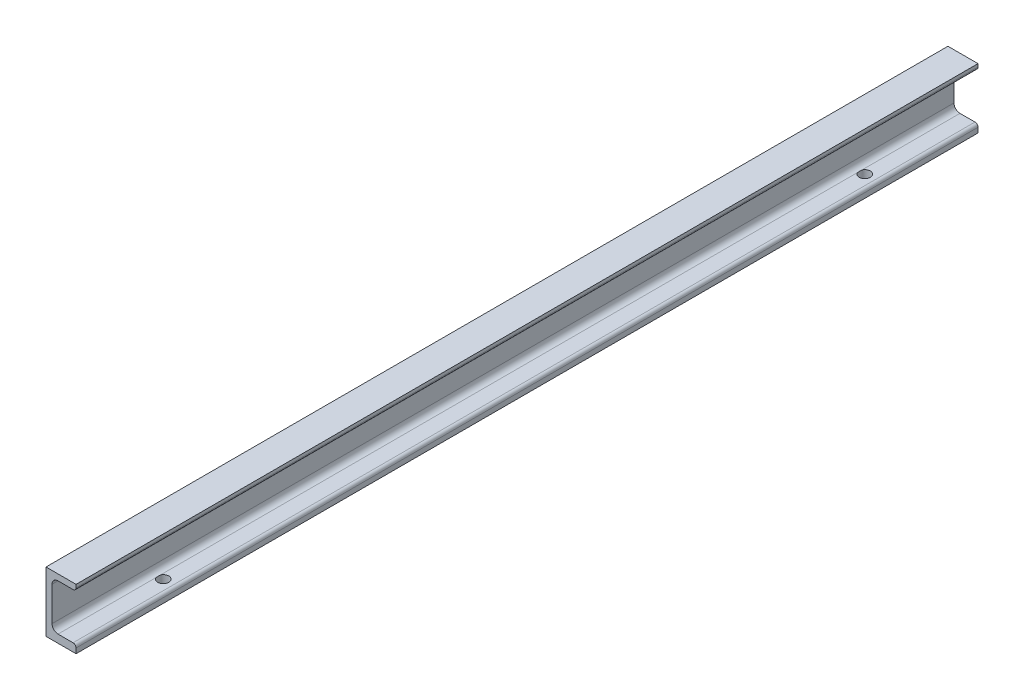
ISO-10303-21;
HEADER;
FILE_DESCRIPTION(('STEP AP214'),'2;1');
FILE_NAME('part.step','',(''),(''),'','','');
FILE_SCHEMA(('AUTOMOTIVE_DESIGN { 1 0 10303 214 1 1 1 1 }'));
ENDSEC;
DATA;
#1=APPLICATION_CONTEXT('core data for automotive mechanical design processes');
#2=APPLICATION_PROTOCOL_DEFINITION('international standard','automotive_design',2000,#1);
#3=PRODUCT_CONTEXT('',#1,'mechanical');
#4=PRODUCT('Part','Part','',(#3));
#5=PRODUCT_RELATED_PRODUCT_CATEGORY('part','',(#4));
#6=PRODUCT_DEFINITION_FORMATION('','',#4);
#7=PRODUCT_DEFINITION_CONTEXT('part definition',#1,'design');
#8=PRODUCT_DEFINITION('design','',#6,#7);
#9=PRODUCT_DEFINITION_SHAPE('','',#8);
#10=(LENGTH_UNIT() NAMED_UNIT(*) SI_UNIT(.MILLI.,.METRE.));
#11=(NAMED_UNIT(*) PLANE_ANGLE_UNIT() SI_UNIT($,.RADIAN.));
#12=(NAMED_UNIT(*) SI_UNIT($,.STERADIAN.) SOLID_ANGLE_UNIT());
#13=UNCERTAINTY_MEASURE_WITH_UNIT(LENGTH_MEASURE(1.E-05),#10,'distance_accuracy_value','');
#14=(GEOMETRIC_REPRESENTATION_CONTEXT(3) GLOBAL_UNCERTAINTY_ASSIGNED_CONTEXT((#13)) GLOBAL_UNIT_ASSIGNED_CONTEXT((#10,
#11,#12)) REPRESENTATION_CONTEXT('',''));
#15=CARTESIAN_POINT('',(0.,0.,0.));
#16=DIRECTION('',(0.,0.,1.));
#17=DIRECTION('',(1.,0.,0.));
#18=AXIS2_PLACEMENT_3D('',#15,#16,#17);
#19=CARTESIAN_POINT('',(15.,27.,450.));
#20=DIRECTION('',(-1.,0.,0.));
#21=DIRECTION('',(0.,0.,1.));
#22=AXIS2_PLACEMENT_3D('',#19,#20,#21);
#23=PLANE('',#22);
#24=DIRECTION('',(0.,1.,0.));
#25=VECTOR('',#24,1.);
#26=CARTESIAN_POINT('',(15.,27.,-450.));
#27=LINE('',#26,#25);
#28=CARTESIAN_POINT('',(15.,27.,-450.));
#29=VERTEX_POINT('',#28);
#30=CARTESIAN_POINT('',(15.,30.,-450.));
#31=VERTEX_POINT('',#30);
#32=EDGE_CURVE('E211',#29,#31,#27,.T.);
#33=ORIENTED_EDGE('',*,*,#32,.T.);
#34=DIRECTION('',(0.,0.,-1.));
#35=VECTOR('',#34,1.);
#36=CARTESIAN_POINT('',(15.,30.,450.));
#37=LINE('',#36,#35);
#38=CARTESIAN_POINT('',(15.,30.,450.));
#39=VERTEX_POINT('',#38);
#40=EDGE_CURVE('E11',#39,#31,#37,.T.);
#41=ORIENTED_EDGE('',*,*,#40,.F.);
#42=DIRECTION('',(0.,1.,0.));
#43=VECTOR('',#42,1.);
#44=CARTESIAN_POINT('',(15.,27.,450.));
#45=LINE('',#44,#43);
#46=CARTESIAN_POINT('',(15.,27.,450.));
#47=VERTEX_POINT('',#46);
#48=EDGE_CURVE('E238',#47,#39,#45,.T.);
#49=ORIENTED_EDGE('',*,*,#48,.F.);
#50=DIRECTION('',(0.,0.,-1.));
#51=VECTOR('',#50,1.);
#52=CARTESIAN_POINT('',(15.,27.,450.));
#53=LINE('',#52,#51);
#54=EDGE_CURVE('E239',#47,#29,#53,.T.);
#55=ORIENTED_EDGE('',*,*,#54,.T.);
#56=EDGE_LOOP('',(#33,#41,#49,#55));
#57=FACE_BOUND('',#56,.T.);
#58=ADVANCED_FACE('F38',(#57),#23,.F.);
#59=CARTESIAN_POINT('',(-15.,30.,450.));
#60=DIRECTION('',(0.,-1.,0.));
#61=DIRECTION('',(0.,0.,-1.));
#62=AXIS2_PLACEMENT_3D('',#59,#60,#61);
#63=PLANE('',#62);
#64=DIRECTION('',(-1.,0.,0.));
#65=VECTOR('',#64,1.);
#66=CARTESIAN_POINT('',(-15.,30.,-450.));
#67=LINE('',#66,#65);
#68=CARTESIAN_POINT('',(-15.,30.,-450.));
#69=VERTEX_POINT('',#68);
#70=EDGE_CURVE('E202',#31,#69,#67,.T.);
#71=ORIENTED_EDGE('',*,*,#70,.T.);
#72=DIRECTION('',(0.,0.,-1.));
#73=VECTOR('',#72,1.);
#74=CARTESIAN_POINT('',(-15.,30.,450.));
#75=LINE('',#74,#73);
#76=CARTESIAN_POINT('',(-15.,30.,450.));
#77=VERTEX_POINT('',#76);
#78=EDGE_CURVE('E46',#77,#69,#75,.T.);
#79=ORIENTED_EDGE('',*,*,#78,.F.);
#80=DIRECTION('',(-1.,0.,0.));
#81=VECTOR('',#80,1.);
#82=CARTESIAN_POINT('',(-15.,30.,450.));
#83=LINE('',#82,#81);
#84=EDGE_CURVE('E307',#39,#77,#83,.T.);
#85=ORIENTED_EDGE('',*,*,#84,.F.);
#86=ORIENTED_EDGE('',*,*,#40,.T.);
#87=EDGE_LOOP('',(#71,#79,#85,#86));
#88=FACE_BOUND('',#87,.T.);
#89=ADVANCED_FACE('F339',(#88),#63,.F.);
#90=CARTESIAN_POINT('',(-15.,-30.,450.));
#91=DIRECTION('',(1.,0.,0.));
#92=DIRECTION('',(0.,0.,-1.));
#93=AXIS2_PLACEMENT_3D('',#90,#91,#92);
#94=PLANE('',#93);
#95=DIRECTION('',(0.,-1.,0.));
#96=VECTOR('',#95,1.);
#97=CARTESIAN_POINT('',(-15.,-30.,-450.));
#98=LINE('',#97,#96);
#99=CARTESIAN_POINT('',(-15.,-30.,-450.));
#100=VERTEX_POINT('',#99);
#101=EDGE_CURVE('E195',#69,#100,#98,.T.);
#102=ORIENTED_EDGE('',*,*,#101,.T.);
#103=DIRECTION('',(0.,0.,-1.));
#104=VECTOR('',#103,1.);
#105=CARTESIAN_POINT('',(-15.,-30.,450.));
#106=LINE('',#105,#104);
#107=CARTESIAN_POINT('',(-15.,-30.,450.));
#108=VERTEX_POINT('',#107);
#109=EDGE_CURVE('E184',#108,#100,#106,.T.);
#110=ORIENTED_EDGE('',*,*,#109,.F.);
#111=DIRECTION('',(0.,-1.,0.));
#112=VECTOR('',#111,1.);
#113=CARTESIAN_POINT('',(-15.,-30.,450.));
#114=LINE('',#113,#112);
#115=EDGE_CURVE('E196',#77,#108,#114,.T.);
#116=ORIENTED_EDGE('',*,*,#115,.F.);
#117=ORIENTED_EDGE('',*,*,#78,.T.);
#118=EDGE_LOOP('',(#102,#110,#116,#117));
#119=FACE_BOUND('',#118,.T.);
#120=ADVANCED_FACE('F193',(#119),#94,.F.);
#121=CARTESIAN_POINT('',(-15.,-30.,450.));
#122=DIRECTION('',(0.,1.,0.));
#123=DIRECTION('',(0.,0.,1.));
#124=AXIS2_PLACEMENT_3D('',#121,#122,#123);
#125=PLANE('',#124);
#126=CARTESIAN_POINT('',(2.,-30.,-350.));
#127=DIRECTION('',(0.,1.,0.));
#128=DIRECTION('',(0.,0.,1.));
#129=AXIS2_PLACEMENT_3D('',#126,#127,#128);
#130=CIRCLE('',#129,5.50000000000001);
#131=CARTESIAN_POINT('',(2.,-30.,-344.5));
#132=VERTEX_POINT('',#131);
#133=EDGE_CURVE('E160',#132,#132,#130,.F.);
#134=ORIENTED_EDGE('',*,*,#133,.F.);
#135=EDGE_LOOP('',(#134));
#136=FACE_BOUND('',#135,.T.);
#137=CARTESIAN_POINT('',(2.,-30.,350.));
#138=DIRECTION('',(0.,1.,0.));
#139=DIRECTION('',(0.,0.,1.));
#140=AXIS2_PLACEMENT_3D('',#137,#138,#139);
#141=CIRCLE('',#140,5.50000000000001);
#142=CARTESIAN_POINT('',(2.,-30.,355.5));
#143=VERTEX_POINT('',#142);
#144=EDGE_CURVE('E291',#143,#143,#141,.T.);
#145=ORIENTED_EDGE('',*,*,#144,.T.);
#146=EDGE_LOOP('',(#145));
#147=FACE_BOUND('',#146,.T.);
#148=DIRECTION('',(1.,0.,0.));
#149=VECTOR('',#148,1.);
#150=CARTESIAN_POINT('',(-15.,-30.,-450.));
#151=LINE('',#150,#149);
#152=CARTESIAN_POINT('',(15.,-30.,-450.));
#153=VERTEX_POINT('',#152);
#154=EDGE_CURVE('E204',#100,#153,#151,.T.);
#155=ORIENTED_EDGE('',*,*,#154,.T.);
#156=DIRECTION('',(0.,0.,-1.));
#157=VECTOR('',#156,1.);
#158=CARTESIAN_POINT('',(15.,-30.,450.));
#159=LINE('',#158,#157);
#160=CARTESIAN_POINT('',(15.,-30.,450.));
#161=VERTEX_POINT('',#160);
#162=EDGE_CURVE('E180',#161,#153,#159,.T.);
#163=ORIENTED_EDGE('',*,*,#162,.F.);
#164=DIRECTION('',(1.,0.,0.));
#165=VECTOR('',#164,1.);
#166=CARTESIAN_POINT('',(-15.,-30.,450.));
#167=LINE('',#166,#165);
#168=EDGE_CURVE('E312',#108,#161,#167,.T.);
#169=ORIENTED_EDGE('',*,*,#168,.F.);
#170=ORIENTED_EDGE('',*,*,#109,.T.);
#171=EDGE_LOOP('',(#155,#163,#169,#170));
#172=FACE_BOUND('',#171,.T.);
#173=ADVANCED_FACE('F337',(#136,#147,#172),#125,.F.);
#174=CARTESIAN_POINT('',(15.,-30.,450.));
#175=DIRECTION('',(-1.,0.,0.));
#176=DIRECTION('',(0.,0.,1.));
#177=AXIS2_PLACEMENT_3D('',#174,#175,#176);
#178=PLANE('',#177);
#179=DIRECTION('',(0.,1.,0.));
#180=VECTOR('',#179,1.);
#181=CARTESIAN_POINT('',(15.,-30.,-450.));
#182=LINE('',#181,#180);
#183=CARTESIAN_POINT('',(15.,-25.,-450.));
#184=VERTEX_POINT('',#183);
#185=EDGE_CURVE('E209',#153,#184,#182,.T.);
#186=ORIENTED_EDGE('',*,*,#185,.T.);
#187=DIRECTION('',(0.,0.,-1.));
#188=VECTOR('',#187,1.);
#189=CARTESIAN_POINT('',(15.,-25.,450.));
#190=LINE('',#189,#188);
#191=CARTESIAN_POINT('',(15.,-25.,450.));
#192=VERTEX_POINT('',#191);
#193=EDGE_CURVE('E176',#192,#184,#190,.T.);
#194=ORIENTED_EDGE('',*,*,#193,.F.);
#195=DIRECTION('',(0.,1.,0.));
#196=VECTOR('',#195,1.);
#197=CARTESIAN_POINT('',(15.,-30.,450.));
#198=LINE('',#197,#196);
#199=EDGE_CURVE('E315',#161,#192,#198,.T.);
#200=ORIENTED_EDGE('',*,*,#199,.F.);
#201=ORIENTED_EDGE('',*,*,#162,.T.);
#202=EDGE_LOOP('',(#186,#194,#200,#201));
#203=FACE_BOUND('',#202,.T.);
#204=ADVANCED_FACE('F333',(#203),#178,.F.);
#205=CARTESIAN_POINT('',(12.,-25.,450.));
#206=DIRECTION('',(0.,0.,-1.));
#207=DIRECTION('',(-1.,0.,0.));
#208=AXIS2_PLACEMENT_3D('',#205,#206,#207);
#209=CYLINDRICAL_SURFACE('',#208,3.);
#210=CARTESIAN_POINT('',(12.,-25.,-450.));
#211=DIRECTION('',(0.,0.,1.));
#212=DIRECTION('',(-1.,0.,0.));
#213=AXIS2_PLACEMENT_3D('',#210,#211,#212);
#214=CIRCLE('',#213,3.);
#215=CARTESIAN_POINT('',(12.,-22.,-450.));
#216=VERTEX_POINT('',#215);
#217=EDGE_CURVE('E217',#184,#216,#214,.T.);
#218=ORIENTED_EDGE('',*,*,#217,.T.);
#219=DIRECTION('',(0.,0.,-1.));
#220=VECTOR('',#219,1.);
#221=CARTESIAN_POINT('',(12.,-22.,450.));
#222=LINE('',#221,#220);
#223=CARTESIAN_POINT('',(12.,-22.,450.));
#224=VERTEX_POINT('',#223);
#225=EDGE_CURVE('E170',#224,#216,#222,.T.);
#226=ORIENTED_EDGE('',*,*,#225,.F.);
#227=CARTESIAN_POINT('',(12.,-25.,450.));
#228=DIRECTION('',(0.,0.,1.));
#229=DIRECTION('',(-1.,0.,0.));
#230=AXIS2_PLACEMENT_3D('',#227,#228,#229);
#231=CIRCLE('',#230,3.);
#232=EDGE_CURVE('E318',#192,#224,#231,.T.);
#233=ORIENTED_EDGE('',*,*,#232,.F.);
#234=ORIENTED_EDGE('',*,*,#193,.T.);
#235=EDGE_LOOP('',(#218,#226,#233,#234));
#236=FACE_BOUND('',#235,.T.);
#237=ADVANCED_FACE('F331',(#236),#209,.T.);
#238=CARTESIAN_POINT('',(-3.,-22.,450.));
#239=DIRECTION('',(0.,-1.,0.));
#240=DIRECTION('',(0.,0.,-1.));
#241=AXIS2_PLACEMENT_3D('',#238,#239,#240);
#242=PLANE('',#241);
#243=CARTESIAN_POINT('',(2.,-22.,-350.));
#244=DIRECTION('',(0.,-1.,0.));
#245=DIRECTION('',(-1.,0.,0.));
#246=AXIS2_PLACEMENT_3D('',#243,#244,#245);
#247=CIRCLE('',#246,5.50000000000001);
#248=CARTESIAN_POINT('',(-3.,-22.,-352.291287847478));
#249=VERTEX_POINT('',#248);
#250=CARTESIAN_POINT('',(-3.,-22.,-347.708712152522));
#251=VERTEX_POINT('',#250);
#252=EDGE_CURVE('E52',#249,#251,#247,.T.);
#253=ORIENTED_EDGE('',*,*,#252,.T.);
#254=DIRECTION('',(0.,0.,-1.));
#255=VECTOR('',#254,1.);
#256=CARTESIAN_POINT('',(-3.,-22.,450.));
#257=LINE('',#256,#255);
#258=CARTESIAN_POINT('',(-3.,-22.,347.708712152522));
#259=VERTEX_POINT('',#258);
#260=EDGE_CURVE('E147',#259,#251,#257,.T.);
#261=ORIENTED_EDGE('',*,*,#260,.F.);
#262=CARTESIAN_POINT('',(2.,-22.,350.));
#263=DIRECTION('',(0.,1.,0.));
#264=DIRECTION('',(-1.,0.,0.));
#265=AXIS2_PLACEMENT_3D('',#262,#263,#264);
#266=CIRCLE('',#265,5.50000000000001);
#267=CARTESIAN_POINT('',(-3.,-22.,352.291287847478));
#268=VERTEX_POINT('',#267);
#269=EDGE_CURVE('E59',#268,#259,#266,.T.);
#270=ORIENTED_EDGE('',*,*,#269,.F.);
#271=CARTESIAN_POINT('',(-3.,-22.,450.));
#272=VERTEX_POINT('',#271);
#273=EDGE_CURVE('E166',#272,#268,#257,.T.);
#274=ORIENTED_EDGE('',*,*,#273,.F.);
#275=DIRECTION('',(-1.,0.,0.));
#276=VECTOR('',#275,1.);
#277=CARTESIAN_POINT('',(-3.,-22.,450.));
#278=LINE('',#277,#276);
#279=EDGE_CURVE('E321',#224,#272,#278,.T.);
#280=ORIENTED_EDGE('',*,*,#279,.F.);
#281=ORIENTED_EDGE('',*,*,#225,.T.);
#282=DIRECTION('',(-1.,0.,0.));
#283=VECTOR('',#282,1.);
#284=CARTESIAN_POINT('',(-3.,-22.,-450.));
#285=LINE('',#284,#283);
#286=CARTESIAN_POINT('',(-3.,-22.,-450.));
#287=VERTEX_POINT('',#286);
#288=EDGE_CURVE('E220',#216,#287,#285,.T.);
#289=ORIENTED_EDGE('',*,*,#288,.T.);
#290=EDGE_CURVE('E148',#249,#287,#257,.T.);
#291=ORIENTED_EDGE('',*,*,#290,.F.);
#292=EDGE_LOOP('',(#253,#261,#270,#274,#280,#281,#289,#291));
#293=FACE_BOUND('',#292,.T.);
#294=ADVANCED_FACE('F156',(#293),#242,.F.);
#295=CARTESIAN_POINT('',(-3.,-16.,450.));
#296=DIRECTION('',(0.,0.,-1.));
#297=DIRECTION('',(-1.,0.,0.));
#298=AXIS2_PLACEMENT_3D('',#295,#296,#297);
#299=CYLINDRICAL_SURFACE('',#298,6.);
#300=CARTESIAN_POINT('',(-3.,-16.,-450.));
#301=DIRECTION('',(0.,0.,-1.));
#302=DIRECTION('',(1.,0.,0.));
#303=AXIS2_PLACEMENT_3D('',#300,#301,#302);
#304=CIRCLE('',#303,6.);
#305=CARTESIAN_POINT('',(-9.,-16.,-450.));
#306=VERTEX_POINT('',#305);
#307=EDGE_CURVE('E223',#287,#306,#304,.T.);
#308=ORIENTED_EDGE('',*,*,#307,.T.);
#309=DIRECTION('',(0.,0.,-1.));
#310=VECTOR('',#309,1.);
#311=CARTESIAN_POINT('',(-9.,-16.,450.));
#312=LINE('',#311,#310);
#313=CARTESIAN_POINT('',(-9.,-16.,450.));
#314=VERTEX_POINT('',#313);
#315=EDGE_CURVE('E171',#314,#306,#312,.T.);
#316=ORIENTED_EDGE('',*,*,#315,.F.);
#317=CARTESIAN_POINT('',(-3.,-16.,450.));
#318=DIRECTION('',(0.,0.,-1.));
#319=DIRECTION('',(1.,0.,0.));
#320=AXIS2_PLACEMENT_3D('',#317,#318,#319);
#321=CIRCLE('',#320,6.);
#322=EDGE_CURVE('E284',#272,#314,#321,.T.);
#323=ORIENTED_EDGE('',*,*,#322,.F.);
#324=ORIENTED_EDGE('',*,*,#273,.T.);
#325=EDGE_CURVE('E163',#268,#259,#257,.T.);
#326=ORIENTED_EDGE('',*,*,#325,.T.);
#327=ORIENTED_EDGE('',*,*,#260,.T.);
#328=EDGE_CURVE('E140',#251,#249,#257,.T.);
#329=ORIENTED_EDGE('',*,*,#328,.T.);
#330=ORIENTED_EDGE('',*,*,#290,.T.);
#331=EDGE_LOOP('',(#308,#316,#323,#324,#326,#327,#329,#330));
#332=FACE_BOUND('',#331,.T.);
#333=ADVANCED_FACE('F161',(#332),#299,.F.);
#334=CARTESIAN_POINT('',(-9.,18.,450.));
#335=DIRECTION('',(-1.,0.,0.));
#336=DIRECTION('',(0.,-1.,0.));
#337=AXIS2_PLACEMENT_3D('',#334,#335,#336);
#338=PLANE('',#337);
#339=DIRECTION('',(0.,1.,0.));
#340=VECTOR('',#339,1.);
#341=CARTESIAN_POINT('',(-9.,18.,-450.));
#342=LINE('',#341,#340);
#343=CARTESIAN_POINT('',(-9.,18.,-450.));
#344=VERTEX_POINT('',#343);
#345=EDGE_CURVE('E226',#306,#344,#342,.T.);
#346=ORIENTED_EDGE('',*,*,#345,.T.);
#347=DIRECTION('',(0.,0.,-1.));
#348=VECTOR('',#347,1.);
#349=CARTESIAN_POINT('',(-9.,18.,450.));
#350=LINE('',#349,#348);
#351=CARTESIAN_POINT('',(-9.,18.,450.));
#352=VERTEX_POINT('',#351);
#353=EDGE_CURVE('E251',#352,#344,#350,.T.);
#354=ORIENTED_EDGE('',*,*,#353,.F.);
#355=DIRECTION('',(0.,1.,0.));
#356=VECTOR('',#355,1.);
#357=CARTESIAN_POINT('',(-9.,18.,450.));
#358=LINE('',#357,#356);
#359=EDGE_CURVE('E272',#314,#352,#358,.T.);
#360=ORIENTED_EDGE('',*,*,#359,.F.);
#361=ORIENTED_EDGE('',*,*,#315,.T.);
#362=EDGE_LOOP('',(#346,#354,#360,#361));
#363=FACE_BOUND('',#362,.T.);
#364=ADVANCED_FACE('F271',(#363),#338,.F.);
#365=CARTESIAN_POINT('',(-3.,18.,450.));
#366=DIRECTION('',(0.,0.,-1.));
#367=DIRECTION('',(-1.,0.,0.));
#368=AXIS2_PLACEMENT_3D('',#365,#366,#367);
#369=CYLINDRICAL_SURFACE('',#368,6.);
#370=CARTESIAN_POINT('',(-3.,18.,-450.));
#371=DIRECTION('',(0.,0.,-1.));
#372=DIRECTION('',(1.,0.,0.));
#373=AXIS2_PLACEMENT_3D('',#370,#371,#372);
#374=CIRCLE('',#373,6.);
#375=CARTESIAN_POINT('',(-3.,24.,-450.));
#376=VERTEX_POINT('',#375);
#377=EDGE_CURVE('E229',#344,#376,#374,.T.);
#378=ORIENTED_EDGE('',*,*,#377,.T.);
#379=DIRECTION('',(0.,0.,-1.));
#380=VECTOR('',#379,1.);
#381=CARTESIAN_POINT('',(-3.,24.,450.));
#382=LINE('',#381,#380);
#383=CARTESIAN_POINT('',(-3.,24.,450.));
#384=VERTEX_POINT('',#383);
#385=EDGE_CURVE('E248',#384,#376,#382,.T.);
#386=ORIENTED_EDGE('',*,*,#385,.F.);
#387=CARTESIAN_POINT('',(-3.,18.,450.));
#388=DIRECTION('',(0.,0.,-1.));
#389=DIRECTION('',(1.,0.,0.));
#390=AXIS2_PLACEMENT_3D('',#387,#388,#389);
#391=CIRCLE('',#390,6.);
#392=EDGE_CURVE('E274',#352,#384,#391,.T.);
#393=ORIENTED_EDGE('',*,*,#392,.F.);
#394=ORIENTED_EDGE('',*,*,#353,.T.);
#395=EDGE_LOOP('',(#378,#386,#393,#394));
#396=FACE_BOUND('',#395,.T.);
#397=ADVANCED_FACE('F275',(#396),#369,.F.);
#398=CARTESIAN_POINT('',(12.,24.,450.));
#399=DIRECTION('',(0.,1.,0.));
#400=DIRECTION('',(0.,0.,1.));
#401=AXIS2_PLACEMENT_3D('',#398,#399,#400);
#402=PLANE('',#401);
#403=DIRECTION('',(1.,0.,0.));
#404=VECTOR('',#403,1.);
#405=CARTESIAN_POINT('',(12.,24.,-450.));
#406=LINE('',#405,#404);
#407=CARTESIAN_POINT('',(12.,24.,-450.));
#408=VERTEX_POINT('',#407);
#409=EDGE_CURVE('E232',#376,#408,#406,.T.);
#410=ORIENTED_EDGE('',*,*,#409,.T.);
#411=DIRECTION('',(0.,0.,-1.));
#412=VECTOR('',#411,1.);
#413=CARTESIAN_POINT('',(12.,24.,450.));
#414=LINE('',#413,#412);
#415=CARTESIAN_POINT('',(12.,24.,450.));
#416=VERTEX_POINT('',#415);
#417=EDGE_CURVE('E243',#416,#408,#414,.T.);
#418=ORIENTED_EDGE('',*,*,#417,.F.);
#419=DIRECTION('',(1.,0.,0.));
#420=VECTOR('',#419,1.);
#421=CARTESIAN_POINT('',(12.,24.,450.));
#422=LINE('',#421,#420);
#423=EDGE_CURVE('E279',#384,#416,#422,.T.);
#424=ORIENTED_EDGE('',*,*,#423,.F.);
#425=ORIENTED_EDGE('',*,*,#385,.T.);
#426=EDGE_LOOP('',(#410,#418,#424,#425));
#427=FACE_BOUND('',#426,.T.);
#428=ADVANCED_FACE('F347',(#427),#402,.F.);
#429=CARTESIAN_POINT('',(12.,27.,450.));
#430=DIRECTION('',(0.,0.,-1.));
#431=DIRECTION('',(-1.,0.,0.));
#432=AXIS2_PLACEMENT_3D('',#429,#430,#431);
#433=CYLINDRICAL_SURFACE('',#432,3.);
#434=CARTESIAN_POINT('',(12.,27.,-450.));
#435=DIRECTION('',(0.,0.,1.));
#436=DIRECTION('',(1.,0.,0.));
#437=AXIS2_PLACEMENT_3D('',#434,#435,#436);
#438=CIRCLE('',#437,3.);
#439=EDGE_CURVE('E235',#408,#29,#438,.T.);
#440=ORIENTED_EDGE('',*,*,#439,.T.);
#441=ORIENTED_EDGE('',*,*,#54,.F.);
#442=CARTESIAN_POINT('',(12.,27.,450.));
#443=DIRECTION('',(0.,0.,1.));
#444=DIRECTION('',(1.,0.,0.));
#445=AXIS2_PLACEMENT_3D('',#442,#443,#444);
#446=CIRCLE('',#445,3.);
#447=EDGE_CURVE('E244',#416,#47,#446,.T.);
#448=ORIENTED_EDGE('',*,*,#447,.F.);
#449=ORIENTED_EDGE('',*,*,#417,.T.);
#450=EDGE_LOOP('',(#440,#441,#448,#449));
#451=FACE_BOUND('',#450,.T.);
#452=ADVANCED_FACE('F344',(#451),#433,.T.);
#453=CARTESIAN_POINT('',(12.,-25.,450.));
#454=DIRECTION('',(0.,0.,-1.));
#455=DIRECTION('',(-1.,0.,0.));
#456=AXIS2_PLACEMENT_3D('',#453,#454,#455);
#457=PLANE('',#456);
#458=ORIENTED_EDGE('',*,*,#48,.T.);
#459=ORIENTED_EDGE('',*,*,#84,.T.);
#460=ORIENTED_EDGE('',*,*,#115,.T.);
#461=ORIENTED_EDGE('',*,*,#168,.T.);
#462=ORIENTED_EDGE('',*,*,#199,.T.);
#463=ORIENTED_EDGE('',*,*,#232,.T.);
#464=ORIENTED_EDGE('',*,*,#279,.T.);
#465=ORIENTED_EDGE('',*,*,#322,.T.);
#466=ORIENTED_EDGE('',*,*,#359,.T.);
#467=ORIENTED_EDGE('',*,*,#392,.T.);
#468=ORIENTED_EDGE('',*,*,#423,.T.);
#469=ORIENTED_EDGE('',*,*,#447,.T.);
#470=EDGE_LOOP('',(#458,#459,#460,#461,#462,#463,#464,#465,#466,#467,#468,#469));
#471=FACE_BOUND('',#470,.T.);
#472=ADVANCED_FACE('F325',(#471),#457,.F.);
#473=CARTESIAN_POINT('',(12.,-25.,-450.));
#474=DIRECTION('',(0.,0.,-1.));
#475=DIRECTION('',(-1.,0.,0.));
#476=AXIS2_PLACEMENT_3D('',#473,#474,#475);
#477=PLANE('',#476);
#478=ORIENTED_EDGE('',*,*,#32,.F.);
#479=ORIENTED_EDGE('',*,*,#439,.F.);
#480=ORIENTED_EDGE('',*,*,#409,.F.);
#481=ORIENTED_EDGE('',*,*,#377,.F.);
#482=ORIENTED_EDGE('',*,*,#345,.F.);
#483=ORIENTED_EDGE('',*,*,#307,.F.);
#484=ORIENTED_EDGE('',*,*,#288,.F.);
#485=ORIENTED_EDGE('',*,*,#217,.F.);
#486=ORIENTED_EDGE('',*,*,#185,.F.);
#487=ORIENTED_EDGE('',*,*,#154,.F.);
#488=ORIENTED_EDGE('',*,*,#101,.F.);
#489=ORIENTED_EDGE('',*,*,#70,.F.);
#490=EDGE_LOOP('',(#478,#479,#480,#481,#482,#483,#484,#485,#486,#487,#488,#489));
#491=FACE_BOUND('',#490,.T.);
#492=ADVANCED_FACE('F201',(#491),#477,.T.);
#493=CARTESIAN_POINT('',(2.,-32.,350.));
#494=DIRECTION('',(0.,1.,0.));
#495=DIRECTION('',(-1.,0.,0.));
#496=AXIS2_PLACEMENT_3D('',#493,#494,#495);
#497=CYLINDRICAL_SURFACE('',#496,5.50000000000001);
#498=ORIENTED_EDGE('',*,*,#269,.T.);
#499=EDGE_CURVE('E300',#259,#268,#266,.T.);
#500=ORIENTED_EDGE('',*,*,#499,.T.);
#501=EDGE_LOOP('',(#498,#500));
#502=FACE_BOUND('',#501,.T.);
#503=ORIENTED_EDGE('',*,*,#144,.F.);
#504=EDGE_LOOP('',(#503));
#505=FACE_BOUND('',#504,.T.);
#506=ADVANCED_FACE('F415',(#502,#505),#497,.F.);
#507=CARTESIAN_POINT('',(2.,-22.,350.));
#508=DIRECTION('',(0.,1.,0.));
#509=DIRECTION('',(-1.,0.,0.));
#510=AXIS2_PLACEMENT_3D('',#507,#508,#509);
#511=PLANE('',#510);
#512=ORIENTED_EDGE('',*,*,#325,.F.);
#513=ORIENTED_EDGE('',*,*,#499,.F.);
#514=EDGE_LOOP('',(#512,#513));
#515=FACE_BOUND('',#514,.T.);
#516=ADVANCED_FACE('F424',(#515),#511,.F.);
#517=CARTESIAN_POINT('',(2.,-32.,-350.));
#518=DIRECTION('',(0.,1.,0.));
#519=DIRECTION('',(-1.,0.,0.));
#520=AXIS2_PLACEMENT_3D('',#517,#518,#519);
#521=CYLINDRICAL_SURFACE('',#520,5.50000000000001);
#522=ORIENTED_EDGE('',*,*,#252,.F.);
#523=EDGE_CURVE('E142',#251,#249,#247,.T.);
#524=ORIENTED_EDGE('',*,*,#523,.F.);
#525=EDGE_LOOP('',(#522,#524));
#526=FACE_BOUND('',#525,.T.);
#527=ORIENTED_EDGE('',*,*,#133,.T.);
#528=EDGE_LOOP('',(#527));
#529=FACE_BOUND('',#528,.T.);
#530=ADVANCED_FACE('F150',(#526,#529),#521,.F.);
#531=CARTESIAN_POINT('',(2.,-22.,-350.));
#532=DIRECTION('',(0.,1.,0.));
#533=DIRECTION('',(-1.,0.,0.));
#534=AXIS2_PLACEMENT_3D('',#531,#532,#533);
#535=PLANE('',#534);
#536=ORIENTED_EDGE('',*,*,#328,.F.);
#537=ORIENTED_EDGE('',*,*,#523,.T.);
#538=EDGE_LOOP('',(#536,#537));
#539=FACE_BOUND('',#538,.T.);
#540=ADVANCED_FACE('F141',(#539),#535,.F.);
#541=CLOSED_SHELL('',(#58,#89,#120,#173,#204,#237,#294,#333,#364,#397,#428,#452,#472,#492,#506,
#516,#530,#540));
#542=MANIFOLD_SOLID_BREP('B2',#541);
#543=ADVANCED_BREP_SHAPE_REPRESENTATION('',(#18,#542),#14);
#544=SHAPE_DEFINITION_REPRESENTATION(#9,#543);
ENDSEC;
END-ISO-10303-21;
